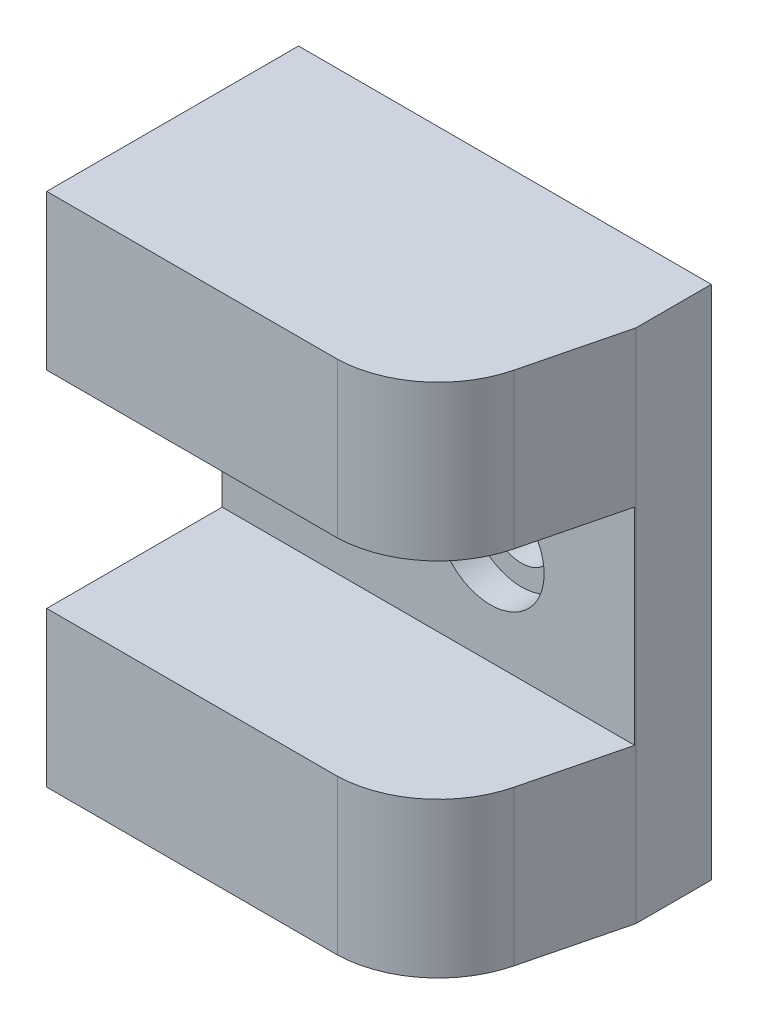
ISO-10303-21;
HEADER;
FILE_DESCRIPTION(('STEP AP214'),'2;1');
FILE_NAME('part.step','',(''),(''),'','','');
FILE_SCHEMA(('AUTOMOTIVE_DESIGN { 1 0 10303 214 1 1 1 1 }'));
ENDSEC;
DATA;
#1=APPLICATION_CONTEXT('core data for automotive mechanical design processes');
#2=APPLICATION_PROTOCOL_DEFINITION('international standard','automotive_design',2000,#1);
#3=PRODUCT_CONTEXT('',#1,'mechanical');
#4=PRODUCT('Part','Part','',(#3));
#5=PRODUCT_RELATED_PRODUCT_CATEGORY('part','',(#4));
#6=PRODUCT_DEFINITION_FORMATION('','',#4);
#7=PRODUCT_DEFINITION_CONTEXT('part definition',#1,'design');
#8=PRODUCT_DEFINITION('design','',#6,#7);
#9=PRODUCT_DEFINITION_SHAPE('','',#8);
#10=(LENGTH_UNIT() NAMED_UNIT(*) SI_UNIT(.MILLI.,.METRE.));
#11=(NAMED_UNIT(*) PLANE_ANGLE_UNIT() SI_UNIT($,.RADIAN.));
#12=(NAMED_UNIT(*) SI_UNIT($,.STERADIAN.) SOLID_ANGLE_UNIT());
#13=UNCERTAINTY_MEASURE_WITH_UNIT(LENGTH_MEASURE(1.E-05),#10,'distance_accuracy_value','');
#14=(GEOMETRIC_REPRESENTATION_CONTEXT(3) GLOBAL_UNCERTAINTY_ASSIGNED_CONTEXT((#13)) GLOBAL_UNIT_ASSIGNED_CONTEXT((#10,
#11,#12)) REPRESENTATION_CONTEXT('',''));
#15=CARTESIAN_POINT('',(0.,0.,0.));
#16=DIRECTION('',(0.,0.,1.));
#17=DIRECTION('',(1.,0.,0.));
#18=AXIS2_PLACEMENT_3D('',#15,#16,#17);
#19=CARTESIAN_POINT('',(0.,0.,12.2));
#20=DIRECTION('',(0.,0.,1.));
#21=DIRECTION('',(1.,0.,0.));
#22=AXIS2_PLACEMENT_3D('',#19,#20,#21);
#23=PLANE('',#22);
#24=DIRECTION('',(1.,0.,0.));
#25=VECTOR('',#24,1.);
#26=CARTESIAN_POINT('',(110.,87.4999999999999,12.2));
#27=LINE('',#26,#25);
#28=CARTESIAN_POINT('',(110.,87.4999999999999,12.2));
#29=VERTEX_POINT('',#28);
#30=CARTESIAN_POINT('',(124.083012975502,87.4999999999999,12.2));
#31=VERTEX_POINT('',#30);
#32=EDGE_CURVE('E125',#29,#31,#27,.T.);
#33=ORIENTED_EDGE('',*,*,#32,.F.);
#34=DIRECTION('',(0.,-1.,0.));
#35=VECTOR('',#34,1.);
#36=CARTESIAN_POINT('',(110.,79.9999999999999,12.2));
#37=LINE('',#36,#35);
#38=CARTESIAN_POINT('',(110.,79.9999999999999,12.2));
#39=VERTEX_POINT('',#38);
#40=EDGE_CURVE('E169',#29,#39,#37,.T.);
#41=ORIENTED_EDGE('',*,*,#40,.T.);
#42=DIRECTION('',(1.,0.,0.));
#43=VECTOR('',#42,1.);
#44=CARTESIAN_POINT('',(130.,79.9999999999999,12.2));
#45=LINE('',#44,#43);
#46=CARTESIAN_POINT('',(124.083012975502,79.9999999999999,12.2));
#47=VERTEX_POINT('',#46);
#48=EDGE_CURVE('E173',#39,#47,#45,.T.);
#49=ORIENTED_EDGE('',*,*,#48,.T.);
#50=DIRECTION('',(0.,1.,0.));
#51=VECTOR('',#50,1.);
#52=CARTESIAN_POINT('',(124.083012975502,78.4999999999999,12.2));
#53=LINE('',#52,#51);
#54=EDGE_CURVE('E194',#31,#47,#53,.F.);
#55=ORIENTED_EDGE('',*,*,#54,.F.);
#56=EDGE_LOOP('',(#33,#41,#49,#55));
#57=FACE_BOUND('',#56,.T.);
#58=ADVANCED_FACE('F35',(#57),#23,.T.);
#59=CARTESIAN_POINT('',(123.933348855707,78.4999999999999,7.16594548587855));
#60=DIRECTION('',(0.,1.,0.));
#61=DIRECTION('',(-1.,0.,0.));
#62=AXIS2_PLACEMENT_3D('',#59,#60,#61);
#63=CYLINDRICAL_SURFACE('',#62,5.0362788048221);
#64=DIRECTION('',(0.,1.,0.));
#65=VECTOR('',#64,1.);
#66=CARTESIAN_POINT('',(128.820028656361,78.4999999999999,8.38433160110954));
#67=LINE('',#66,#65);
#68=CARTESIAN_POINT('',(128.820028656361,79.9999999999999,8.38433160110954));
#69=VERTEX_POINT('',#68);
#70=CARTESIAN_POINT('',(128.820028656361,87.4999999999999,8.38433160110954));
#71=VERTEX_POINT('',#70);
#72=EDGE_CURVE('E158',#69,#71,#67,.T.);
#73=ORIENTED_EDGE('',*,*,#72,.T.);
#74=CARTESIAN_POINT('',(123.933348855707,87.4999999999999,7.16594548587855));
#75=DIRECTION('',(0.,-1.,0.));
#76=DIRECTION('',(0.,0.,-1.));
#77=AXIS2_PLACEMENT_3D('',#74,#75,#76);
#78=CIRCLE('',#77,5.0362788048221);
#79=EDGE_CURVE('E43',#71,#31,#78,.T.);
#80=ORIENTED_EDGE('',*,*,#79,.T.);
#81=ORIENTED_EDGE('',*,*,#54,.T.);
#82=CARTESIAN_POINT('',(123.933348855707,79.9999999999999,7.16594548587855));
#83=DIRECTION('',(0.,1.,0.));
#84=DIRECTION('',(0.,0.,1.));
#85=AXIS2_PLACEMENT_3D('',#82,#83,#84);
#86=CIRCLE('',#85,5.0362788048221);
#87=EDGE_CURVE('E161',#69,#47,#86,.F.);
#88=ORIENTED_EDGE('',*,*,#87,.F.);
#89=EDGE_LOOP('',(#73,#80,#81,#88));
#90=FACE_BOUND('',#89,.T.);
#91=ADVANCED_FACE('F204',(#90),#63,.T.);
#92=CARTESIAN_POINT('',(130.,79.9999999999999,12.2));
#93=DIRECTION('',(-1.,0.,0.));
#94=DIRECTION('',(0.,-1.,0.));
#95=AXIS2_PLACEMENT_3D('',#92,#93,#94);
#96=PLANE('',#95);
#97=DIRECTION('',(0.,0.,-1.));
#98=VECTOR('',#97,1.);
#99=CARTESIAN_POINT('',(130.,105.,12.2));
#100=LINE('',#99,#98);
#101=CARTESIAN_POINT('',(130.,105.,3.65172503392192));
#102=VERTEX_POINT('',#101);
#103=CARTESIAN_POINT('',(130.,105.,0.));
#104=VERTEX_POINT('',#103);
#105=EDGE_CURVE('E192',#102,#104,#100,.T.);
#106=ORIENTED_EDGE('',*,*,#105,.F.);
#107=DIRECTION('',(0.,1.,0.));
#108=VECTOR('',#107,1.);
#109=CARTESIAN_POINT('',(130.,78.4999999999999,3.65172503392192));
#110=LINE('',#109,#108);
#111=CARTESIAN_POINT('',(130.,79.9999999999999,3.65172503392192));
#112=VERTEX_POINT('',#111);
#113=EDGE_CURVE('E157',#112,#102,#110,.T.);
#114=ORIENTED_EDGE('',*,*,#113,.F.);
#115=DIRECTION('',(0.,0.,-1.));
#116=VECTOR('',#115,1.);
#117=CARTESIAN_POINT('',(130.,79.9999999999999,12.2));
#118=LINE('',#117,#116);
#119=CARTESIAN_POINT('',(130.,79.9999999999999,0.));
#120=VERTEX_POINT('',#119);
#121=EDGE_CURVE('E176',#112,#120,#118,.T.);
#122=ORIENTED_EDGE('',*,*,#121,.T.);
#123=DIRECTION('',(0.,1.,0.));
#124=VECTOR('',#123,1.);
#125=CARTESIAN_POINT('',(130.,79.9999999999999,0.));
#126=LINE('',#125,#124);
#127=EDGE_CURVE('E166',#120,#104,#126,.T.);
#128=ORIENTED_EDGE('',*,*,#127,.T.);
#129=EDGE_LOOP('',(#106,#114,#122,#128));
#130=FACE_BOUND('',#129,.T.);
#131=ADVANCED_FACE('F37',(#130),#96,.F.);
#132=CARTESIAN_POINT('',(130.,105.,12.2));
#133=DIRECTION('',(0.,-1.,0.));
#134=DIRECTION('',(1.,0.,0.));
#135=AXIS2_PLACEMENT_3D('',#132,#133,#134);
#136=PLANE('',#135);
#137=DIRECTION('',(-1.,0.,0.));
#138=VECTOR('',#137,1.);
#139=CARTESIAN_POINT('',(130.,105.,12.2));
#140=LINE('',#139,#138);
#141=CARTESIAN_POINT('',(124.083012975501,105.,12.2));
#142=VERTEX_POINT('',#141);
#143=CARTESIAN_POINT('',(110.,105.,12.2));
#144=VERTEX_POINT('',#143);
#145=EDGE_CURVE('E167',#142,#144,#140,.T.);
#146=ORIENTED_EDGE('',*,*,#145,.F.);
#147=CARTESIAN_POINT('',(123.933348855707,105.,7.16594548587855));
#148=DIRECTION('',(0.,-1.,0.));
#149=DIRECTION('',(-1.,0.,0.));
#150=AXIS2_PLACEMENT_3D('',#147,#148,#149);
#151=CIRCLE('',#150,5.0362788048221);
#152=CARTESIAN_POINT('',(128.820028656361,105.,8.38433160110954));
#153=VERTEX_POINT('',#152);
#154=EDGE_CURVE('E58',#153,#142,#151,.T.);
#155=ORIENTED_EDGE('',*,*,#154,.F.);
#156=DIRECTION('',(-0.241921895599665,0.,0.970295726275997));
#157=VECTOR('',#156,1.);
#158=CARTESIAN_POINT('',(128.820028656361,105.,8.38433160110954));
#159=LINE('',#158,#157);
#160=EDGE_CURVE('E154',#102,#153,#159,.T.);
#161=ORIENTED_EDGE('',*,*,#160,.F.);
#162=ORIENTED_EDGE('',*,*,#105,.T.);
#163=DIRECTION('',(-1.,0.,0.));
#164=VECTOR('',#163,1.);
#165=CARTESIAN_POINT('',(130.,105.,0.));
#166=LINE('',#165,#164);
#167=CARTESIAN_POINT('',(110.,105.,0.));
#168=VERTEX_POINT('',#167);
#169=EDGE_CURVE('E179',#104,#168,#166,.T.);
#170=ORIENTED_EDGE('',*,*,#169,.T.);
#171=DIRECTION('',(0.,0.,-1.));
#172=VECTOR('',#171,1.);
#173=CARTESIAN_POINT('',(110.,105.,12.2));
#174=LINE('',#173,#172);
#175=EDGE_CURVE('E189',#144,#168,#174,.T.);
#176=ORIENTED_EDGE('',*,*,#175,.F.);
#177=EDGE_LOOP('',(#146,#155,#161,#162,#170,#176));
#178=FACE_BOUND('',#177,.T.);
#179=ADVANCED_FACE('F252',(#178),#136,.F.);
#180=CARTESIAN_POINT('',(110.,79.9999999999999,12.2));
#181=DIRECTION('',(1.,0.,0.));
#182=DIRECTION('',(0.,1.,0.));
#183=AXIS2_PLACEMENT_3D('',#180,#181,#182);
#184=PLANE('',#183);
#185=ORIENTED_EDGE('',*,*,#40,.F.);
#186=DIRECTION('',(0.,0.,1.));
#187=VECTOR('',#186,1.);
#188=CARTESIAN_POINT('',(110.,87.4999999999999,3.7));
#189=LINE('',#188,#187);
#190=CARTESIAN_POINT('',(110.,87.4999999999999,3.7));
#191=VERTEX_POINT('',#190);
#192=EDGE_CURVE('E135',#191,#29,#189,.T.);
#193=ORIENTED_EDGE('',*,*,#192,.F.);
#194=DIRECTION('',(0.,-1.,0.));
#195=VECTOR('',#194,1.);
#196=CARTESIAN_POINT('',(110.,97.4999999999999,3.7));
#197=LINE('',#196,#195);
#198=CARTESIAN_POINT('',(110.,97.4999999999999,3.7));
#199=VERTEX_POINT('',#198);
#200=EDGE_CURVE('E122',#199,#191,#197,.T.);
#201=ORIENTED_EDGE('',*,*,#200,.F.);
#202=DIRECTION('',(0.,0.,1.));
#203=VECTOR('',#202,1.);
#204=CARTESIAN_POINT('',(110.,97.4999999999999,3.7));
#205=LINE('',#204,#203);
#206=CARTESIAN_POINT('',(110.,97.4999999999999,12.2));
#207=VERTEX_POINT('',#206);
#208=EDGE_CURVE('E128',#199,#207,#205,.T.);
#209=ORIENTED_EDGE('',*,*,#208,.T.);
#210=EDGE_CURVE('E171',#144,#207,#37,.T.);
#211=ORIENTED_EDGE('',*,*,#210,.F.);
#212=ORIENTED_EDGE('',*,*,#175,.T.);
#213=DIRECTION('',(0.,-1.,0.));
#214=VECTOR('',#213,1.);
#215=CARTESIAN_POINT('',(110.,79.9999999999999,0.));
#216=LINE('',#215,#214);
#217=CARTESIAN_POINT('',(110.,79.9999999999999,0.));
#218=VERTEX_POINT('',#217);
#219=EDGE_CURVE('E181',#168,#218,#216,.T.);
#220=ORIENTED_EDGE('',*,*,#219,.T.);
#221=DIRECTION('',(0.,0.,-1.));
#222=VECTOR('',#221,1.);
#223=CARTESIAN_POINT('',(110.,79.9999999999999,12.2));
#224=LINE('',#223,#222);
#225=EDGE_CURVE('E186',#39,#218,#224,.T.);
#226=ORIENTED_EDGE('',*,*,#225,.F.);
#227=EDGE_LOOP('',(#185,#193,#201,#209,#211,#212,#220,#226));
#228=FACE_BOUND('',#227,.T.);
#229=ADVANCED_FACE('F140',(#228),#184,.F.);
#230=CARTESIAN_POINT('',(130.,79.9999999999999,12.2));
#231=DIRECTION('',(0.,1.,0.));
#232=DIRECTION('',(0.,0.,1.));
#233=AXIS2_PLACEMENT_3D('',#230,#231,#232);
#234=PLANE('',#233);
#235=DIRECTION('',(-0.241921895599665,0.,0.970295726275997));
#236=VECTOR('',#235,1.);
#237=CARTESIAN_POINT('',(127.993413996276,79.9999999999999,11.6997019191584));
#238=LINE('',#237,#236);
#239=EDGE_CURVE('E197',#112,#69,#238,.T.);
#240=ORIENTED_EDGE('',*,*,#239,.T.);
#241=ORIENTED_EDGE('',*,*,#87,.T.);
#242=ORIENTED_EDGE('',*,*,#48,.F.);
#243=ORIENTED_EDGE('',*,*,#225,.T.);
#244=DIRECTION('',(1.,0.,0.));
#245=VECTOR('',#244,1.);
#246=CARTESIAN_POINT('',(130.,79.9999999999999,0.));
#247=LINE('',#246,#245);
#248=EDGE_CURVE('E170',#218,#120,#247,.T.);
#249=ORIENTED_EDGE('',*,*,#248,.T.);
#250=ORIENTED_EDGE('',*,*,#121,.F.);
#251=EDGE_LOOP('',(#240,#241,#242,#243,#249,#250));
#252=FACE_BOUND('',#251,.T.);
#253=ADVANCED_FACE('F212',(#252),#234,.F.);
#254=DIRECTION('',(-1.,0.,0.));
#255=VECTOR('',#254,1.);
#256=CARTESIAN_POINT('',(110.,97.4999999999999,12.2));
#257=LINE('',#256,#255);
#258=CARTESIAN_POINT('',(124.083012975502,97.4999999999999,12.2));
#259=VERTEX_POINT('',#258);
#260=EDGE_CURVE('E131',#259,#207,#257,.T.);
#261=ORIENTED_EDGE('',*,*,#260,.F.);
#262=EDGE_CURVE('E195',#142,#259,#53,.F.);
#263=ORIENTED_EDGE('',*,*,#262,.F.);
#264=ORIENTED_EDGE('',*,*,#145,.T.);
#265=ORIENTED_EDGE('',*,*,#210,.T.);
#266=EDGE_LOOP('',(#261,#263,#264,#265));
#267=FACE_BOUND('',#266,.T.);
#268=ADVANCED_FACE('F232',(#267),#23,.T.);
#269=CARTESIAN_POINT('',(0.,0.,0.));
#270=DIRECTION('',(0.,0.,1.));
#271=DIRECTION('',(1.,0.,0.));
#272=AXIS2_PLACEMENT_3D('',#269,#270,#271);
#273=PLANE('',#272);
#274=CARTESIAN_POINT('',(115.,92.4999999999999,0.));
#275=DIRECTION('',(0.,0.,1.));
#276=DIRECTION('',(1.,0.,0.));
#277=AXIS2_PLACEMENT_3D('',#274,#275,#276);
#278=CIRCLE('',#277,1.6);
#279=CARTESIAN_POINT('',(116.6,92.4999999999999,0.));
#280=VERTEX_POINT('',#279);
#281=EDGE_CURVE('E394',#280,#280,#278,.T.);
#282=ORIENTED_EDGE('',*,*,#281,.T.);
#283=EDGE_LOOP('',(#282));
#284=FACE_BOUND('',#283,.T.);
#285=CARTESIAN_POINT('',(123.,92.4999999999998,0.));
#286=DIRECTION('',(0.,0.,1.));
#287=DIRECTION('',(1.,0.,0.));
#288=AXIS2_PLACEMENT_3D('',#285,#286,#287);
#289=CIRCLE('',#288,1.6);
#290=CARTESIAN_POINT('',(124.6,92.4999999999998,0.));
#291=VERTEX_POINT('',#290);
#292=EDGE_CURVE('E146',#291,#291,#289,.T.);
#293=ORIENTED_EDGE('',*,*,#292,.T.);
#294=EDGE_LOOP('',(#293));
#295=FACE_BOUND('',#294,.T.);
#296=ORIENTED_EDGE('',*,*,#127,.F.);
#297=ORIENTED_EDGE('',*,*,#248,.F.);
#298=ORIENTED_EDGE('',*,*,#219,.F.);
#299=ORIENTED_EDGE('',*,*,#169,.F.);
#300=EDGE_LOOP('',(#296,#297,#298,#299));
#301=FACE_BOUND('',#300,.T.);
#302=ADVANCED_FACE('F239',(#284,#295,#301),#273,.F.);
#303=CARTESIAN_POINT('',(128.820028656361,78.4999999999999,8.38433160110954));
#304=DIRECTION('',(-0.970295726275997,0.,-0.241921895599665));
#305=DIRECTION('',(-0.241921895599665,0.,0.970295726275997));
#306=AXIS2_PLACEMENT_3D('',#303,#304,#305);
#307=PLANE('',#306);
#308=DIRECTION('',(0.,1.,0.));
#309=VECTOR('',#308,1.);
#310=CARTESIAN_POINT('',(129.987963699121,78.4999999999999,3.7));
#311=LINE('',#310,#309);
#312=CARTESIAN_POINT('',(129.98796369912,87.4999999999999,3.7));
#313=VERTEX_POINT('',#312);
#314=CARTESIAN_POINT('',(129.98796369912,97.4999999999999,3.7));
#315=VERTEX_POINT('',#314);
#316=EDGE_CURVE('E11',#313,#315,#311,.T.);
#317=ORIENTED_EDGE('',*,*,#316,.F.);
#318=DIRECTION('',(-0.241921895599665,0.,0.970295726275997));
#319=VECTOR('',#318,1.);
#320=CARTESIAN_POINT('',(128.820028656361,87.4999999999999,8.38433160110953));
#321=LINE('',#320,#319);
#322=EDGE_CURVE('E150',#313,#71,#321,.T.);
#323=ORIENTED_EDGE('',*,*,#322,.T.);
#324=ORIENTED_EDGE('',*,*,#72,.F.);
#325=ORIENTED_EDGE('',*,*,#239,.F.);
#326=ORIENTED_EDGE('',*,*,#113,.T.);
#327=ORIENTED_EDGE('',*,*,#160,.T.);
#328=CARTESIAN_POINT('',(128.820028656361,97.4999999999999,8.38433160110954));
#329=VERTEX_POINT('',#328);
#330=EDGE_CURVE('E162',#329,#153,#67,.T.);
#331=ORIENTED_EDGE('',*,*,#330,.F.);
#332=DIRECTION('',(0.241921895599665,0.,-0.970295726275997));
#333=VECTOR('',#332,1.);
#334=CARTESIAN_POINT('',(128.820028656361,97.4999999999999,8.38433160110952));
#335=LINE('',#334,#333);
#336=EDGE_CURVE('E50',#329,#315,#335,.T.);
#337=ORIENTED_EDGE('',*,*,#336,.T.);
#338=EDGE_LOOP('',(#317,#323,#324,#325,#326,#327,#331,#337));
#339=FACE_BOUND('',#338,.T.);
#340=ADVANCED_FACE('F216',(#339),#307,.F.);
#341=ORIENTED_EDGE('',*,*,#262,.T.);
#342=CARTESIAN_POINT('',(123.933348855707,97.4999999999999,7.16594548587855));
#343=DIRECTION('',(0.,1.,0.));
#344=DIRECTION('',(0.,0.,1.));
#345=AXIS2_PLACEMENT_3D('',#342,#343,#344);
#346=CIRCLE('',#345,5.0362788048221);
#347=EDGE_CURVE('E200',#259,#329,#346,.T.);
#348=ORIENTED_EDGE('',*,*,#347,.T.);
#349=ORIENTED_EDGE('',*,*,#330,.T.);
#350=ORIENTED_EDGE('',*,*,#154,.T.);
#351=EDGE_LOOP('',(#341,#348,#349,#350));
#352=FACE_BOUND('',#351,.T.);
#353=ADVANCED_FACE('F227',(#352),#63,.T.);
#354=CARTESIAN_POINT('',(0.,0.,3.7));
#355=DIRECTION('',(0.,0.,1.));
#356=DIRECTION('',(1.,0.,0.));
#357=AXIS2_PLACEMENT_3D('',#354,#355,#356);
#358=PLANE('',#357);
#359=CARTESIAN_POINT('',(115.,92.4999999999999,3.7));
#360=DIRECTION('',(0.,0.,1.));
#361=DIRECTION('',(1.,0.,0.));
#362=AXIS2_PLACEMENT_3D('',#359,#360,#361);
#363=CIRCLE('',#362,2.6);
#364=CARTESIAN_POINT('',(117.6,92.4999999999999,3.7));
#365=VERTEX_POINT('',#364);
#366=EDGE_CURVE('E387',#365,#365,#363,.T.);
#367=ORIENTED_EDGE('',*,*,#366,.F.);
#368=EDGE_LOOP('',(#367));
#369=FACE_BOUND('',#368,.T.);
#370=CARTESIAN_POINT('',(123.,92.4999999999998,3.7));
#371=DIRECTION('',(0.,0.,1.));
#372=DIRECTION('',(1.,0.,0.));
#373=AXIS2_PLACEMENT_3D('',#370,#371,#372);
#374=CIRCLE('',#373,2.59999999999999);
#375=CARTESIAN_POINT('',(125.6,92.4999999999998,3.7));
#376=VERTEX_POINT('',#375);
#377=EDGE_CURVE('E397',#376,#376,#374,.T.);
#378=ORIENTED_EDGE('',*,*,#377,.F.);
#379=EDGE_LOOP('',(#378));
#380=FACE_BOUND('',#379,.T.);
#381=ORIENTED_EDGE('',*,*,#316,.T.);
#382=DIRECTION('',(-1.,0.,0.));
#383=VECTOR('',#382,1.);
#384=CARTESIAN_POINT('',(110.,97.4999999999999,3.7));
#385=LINE('',#384,#383);
#386=EDGE_CURVE('E117',#315,#199,#385,.T.);
#387=ORIENTED_EDGE('',*,*,#386,.T.);
#388=ORIENTED_EDGE('',*,*,#200,.T.);
#389=DIRECTION('',(1.,0.,0.));
#390=VECTOR('',#389,1.);
#391=CARTESIAN_POINT('',(110.,87.4999999999999,3.7));
#392=LINE('',#391,#390);
#393=EDGE_CURVE('E136',#191,#313,#392,.T.);
#394=ORIENTED_EDGE('',*,*,#393,.T.);
#395=EDGE_LOOP('',(#381,#387,#388,#394));
#396=FACE_BOUND('',#395,.T.);
#397=ADVANCED_FACE('F119',(#369,#380,#396),#358,.T.);
#398=CARTESIAN_POINT('',(110.,87.4999999999999,3.7));
#399=DIRECTION('',(0.,-1.,0.));
#400=DIRECTION('',(0.,0.,-1.));
#401=AXIS2_PLACEMENT_3D('',#398,#399,#400);
#402=PLANE('',#401);
#403=ORIENTED_EDGE('',*,*,#393,.F.);
#404=ORIENTED_EDGE('',*,*,#192,.T.);
#405=ORIENTED_EDGE('',*,*,#32,.T.);
#406=ORIENTED_EDGE('',*,*,#79,.F.);
#407=ORIENTED_EDGE('',*,*,#322,.F.);
#408=EDGE_LOOP('',(#403,#404,#405,#406,#407));
#409=FACE_BOUND('',#408,.T.);
#410=ADVANCED_FACE('F218',(#409),#402,.F.);
#411=CARTESIAN_POINT('',(110.,97.4999999999999,3.7));
#412=DIRECTION('',(0.,1.,0.));
#413=DIRECTION('',(0.,0.,1.));
#414=AXIS2_PLACEMENT_3D('',#411,#412,#413);
#415=PLANE('',#414);
#416=ORIENTED_EDGE('',*,*,#347,.F.);
#417=ORIENTED_EDGE('',*,*,#260,.T.);
#418=ORIENTED_EDGE('',*,*,#208,.F.);
#419=ORIENTED_EDGE('',*,*,#386,.F.);
#420=ORIENTED_EDGE('',*,*,#336,.F.);
#421=EDGE_LOOP('',(#416,#417,#418,#419,#420));
#422=FACE_BOUND('',#421,.T.);
#423=ADVANCED_FACE('F129',(#422),#415,.F.);
#424=CARTESIAN_POINT('',(123.,92.4999999999998,3.7));
#425=DIRECTION('',(0.,0.,1.));
#426=DIRECTION('',(1.,0.,0.));
#427=AXIS2_PLACEMENT_3D('',#424,#425,#426);
#428=CYLINDRICAL_SURFACE('',#427,1.6);
#429=ORIENTED_EDGE('',*,*,#292,.F.);
#430=EDGE_LOOP('',(#429));
#431=FACE_BOUND('',#430,.T.);
#432=CARTESIAN_POINT('',(123.,92.4999999999998,2.2));
#433=DIRECTION('',(0.,0.,1.));
#434=DIRECTION('',(1.,0.,0.));
#435=AXIS2_PLACEMENT_3D('',#432,#433,#434);
#436=CIRCLE('',#435,1.6);
#437=CARTESIAN_POINT('',(124.6,92.4999999999998,2.2));
#438=VERTEX_POINT('',#437);
#439=EDGE_CURVE('E403',#438,#438,#436,.T.);
#440=ORIENTED_EDGE('',*,*,#439,.T.);
#441=EDGE_LOOP('',(#440));
#442=FACE_BOUND('',#441,.T.);
#443=ADVANCED_FACE('F225',(#431,#442),#428,.F.);
#444=CARTESIAN_POINT('',(124.6,92.4999999999998,2.2));
#445=DIRECTION('',(0.,0.,-1.));
#446=DIRECTION('',(-1.,0.,0.));
#447=AXIS2_PLACEMENT_3D('',#444,#445,#446);
#448=PLANE('',#447);
#449=ORIENTED_EDGE('',*,*,#439,.F.);
#450=EDGE_LOOP('',(#449));
#451=FACE_BOUND('',#450,.T.);
#452=CARTESIAN_POINT('',(123.,92.4999999999998,2.2));
#453=DIRECTION('',(0.,0.,1.));
#454=DIRECTION('',(1.,0.,0.));
#455=AXIS2_PLACEMENT_3D('',#452,#453,#454);
#456=CIRCLE('',#455,2.59999999999999);
#457=CARTESIAN_POINT('',(125.6,92.4999999999998,2.2));
#458=VERTEX_POINT('',#457);
#459=EDGE_CURVE('E400',#458,#458,#456,.T.);
#460=ORIENTED_EDGE('',*,*,#459,.T.);
#461=EDGE_LOOP('',(#460));
#462=FACE_BOUND('',#461,.T.);
#463=ADVANCED_FACE('F327',(#451,#462),#448,.F.);
#464=CARTESIAN_POINT('',(123.,92.4999999999998,3.7));
#465=DIRECTION('',(0.,0.,1.));
#466=DIRECTION('',(1.,0.,0.));
#467=AXIS2_PLACEMENT_3D('',#464,#465,#466);
#468=CYLINDRICAL_SURFACE('',#467,2.59999999999999);
#469=ORIENTED_EDGE('',*,*,#459,.F.);
#470=EDGE_LOOP('',(#469));
#471=FACE_BOUND('',#470,.T.);
#472=ORIENTED_EDGE('',*,*,#377,.T.);
#473=EDGE_LOOP('',(#472));
#474=FACE_BOUND('',#473,.T.);
#475=ADVANCED_FACE('F337',(#471,#474),#468,.F.);
#476=CARTESIAN_POINT('',(115.,92.4999999999999,3.7));
#477=DIRECTION('',(0.,0.,1.));
#478=DIRECTION('',(1.,0.,0.));
#479=AXIS2_PLACEMENT_3D('',#476,#477,#478);
#480=CYLINDRICAL_SURFACE('',#479,1.6);
#481=ORIENTED_EDGE('',*,*,#281,.F.);
#482=EDGE_LOOP('',(#481));
#483=FACE_BOUND('',#482,.T.);
#484=CARTESIAN_POINT('',(115.,92.4999999999999,2.2));
#485=DIRECTION('',(0.,0.,1.));
#486=DIRECTION('',(1.,0.,0.));
#487=AXIS2_PLACEMENT_3D('',#484,#485,#486);
#488=CIRCLE('',#487,1.6);
#489=CARTESIAN_POINT('',(116.6,92.4999999999999,2.2));
#490=VERTEX_POINT('',#489);
#491=EDGE_CURVE('E389',#490,#490,#488,.T.);
#492=ORIENTED_EDGE('',*,*,#491,.T.);
#493=EDGE_LOOP('',(#492));
#494=FACE_BOUND('',#493,.T.);
#495=ADVANCED_FACE('F347',(#483,#494),#480,.F.);
#496=CARTESIAN_POINT('',(116.6,92.4999999999999,2.2));
#497=DIRECTION('',(0.,0.,-1.));
#498=DIRECTION('',(-1.,0.,0.));
#499=AXIS2_PLACEMENT_3D('',#496,#497,#498);
#500=PLANE('',#499);
#501=ORIENTED_EDGE('',*,*,#491,.F.);
#502=EDGE_LOOP('',(#501));
#503=FACE_BOUND('',#502,.T.);
#504=CARTESIAN_POINT('',(115.,92.4999999999999,2.2));
#505=DIRECTION('',(0.,0.,1.));
#506=DIRECTION('',(1.,0.,0.));
#507=AXIS2_PLACEMENT_3D('',#504,#505,#506);
#508=CIRCLE('',#507,2.6);
#509=CARTESIAN_POINT('',(117.6,92.4999999999999,2.2));
#510=VERTEX_POINT('',#509);
#511=EDGE_CURVE('E384',#510,#510,#508,.T.);
#512=ORIENTED_EDGE('',*,*,#511,.T.);
#513=EDGE_LOOP('',(#512));
#514=FACE_BOUND('',#513,.T.);
#515=ADVANCED_FACE('F357',(#503,#514),#500,.F.);
#516=CARTESIAN_POINT('',(115.,92.4999999999999,3.7));
#517=DIRECTION('',(0.,0.,1.));
#518=DIRECTION('',(1.,0.,0.));
#519=AXIS2_PLACEMENT_3D('',#516,#517,#518);
#520=CYLINDRICAL_SURFACE('',#519,2.6);
#521=ORIENTED_EDGE('',*,*,#511,.F.);
#522=EDGE_LOOP('',(#521));
#523=FACE_BOUND('',#522,.T.);
#524=ORIENTED_EDGE('',*,*,#366,.T.);
#525=EDGE_LOOP('',(#524));
#526=FACE_BOUND('',#525,.T.);
#527=ADVANCED_FACE('F367',(#523,#526),#520,.F.);
#528=CLOSED_SHELL('',(#58,#91,#131,#179,#229,#253,#268,#302,#340,#353,#397,#410,#423,#443,#463,
#475,#495,#515,#527));
#529=MANIFOLD_SOLID_BREP('B2',#528);
#530=ADVANCED_BREP_SHAPE_REPRESENTATION('',(#18,#529),#14);
#531=SHAPE_DEFINITION_REPRESENTATION(#9,#530);
ENDSEC;
END-ISO-10303-21;
